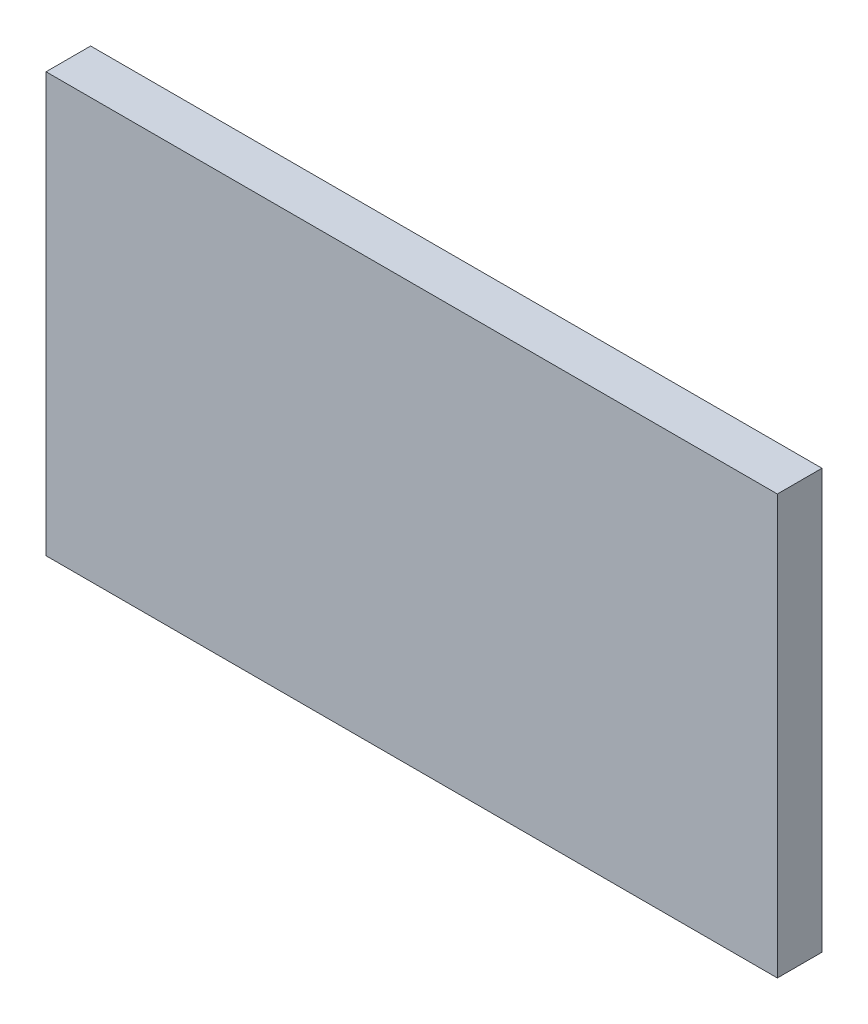
ISO-10303-21;
HEADER;
FILE_DESCRIPTION(('STEP AP214'),'2;1');
FILE_NAME('part.step','',(''),(''),'','','');
FILE_SCHEMA(('AUTOMOTIVE_DESIGN { 1 0 10303 214 1 1 1 1 }'));
ENDSEC;
DATA;
#1=APPLICATION_CONTEXT('core data for automotive mechanical design processes');
#2=APPLICATION_PROTOCOL_DEFINITION('international standard','automotive_design',2000,#1);
#3=PRODUCT_CONTEXT('',#1,'mechanical');
#4=PRODUCT('Part','Part','',(#3));
#5=PRODUCT_RELATED_PRODUCT_CATEGORY('part','',(#4));
#6=PRODUCT_DEFINITION_FORMATION('','',#4);
#7=PRODUCT_DEFINITION_CONTEXT('part definition',#1,'design');
#8=PRODUCT_DEFINITION('design','',#6,#7);
#9=PRODUCT_DEFINITION_SHAPE('','',#8);
#10=(LENGTH_UNIT() NAMED_UNIT(*) SI_UNIT(.MILLI.,.METRE.));
#11=(NAMED_UNIT(*) PLANE_ANGLE_UNIT() SI_UNIT($,.RADIAN.));
#12=(NAMED_UNIT(*) SI_UNIT($,.STERADIAN.) SOLID_ANGLE_UNIT());
#13=UNCERTAINTY_MEASURE_WITH_UNIT(LENGTH_MEASURE(1.E-05),#10,'distance_accuracy_value','');
#14=(GEOMETRIC_REPRESENTATION_CONTEXT(3) GLOBAL_UNCERTAINTY_ASSIGNED_CONTEXT((#13)) GLOBAL_UNIT_ASSIGNED_CONTEXT((#10,
#11,#12)) REPRESENTATION_CONTEXT('',''));
#15=CARTESIAN_POINT('',(0.,0.,0.));
#16=DIRECTION('',(0.,0.,1.));
#17=DIRECTION('',(1.,0.,0.));
#18=AXIS2_PLACEMENT_3D('',#15,#16,#17);
#19=CARTESIAN_POINT('',(0.,0.,1.));
#20=DIRECTION('',(1.,0.,0.));
#21=DIRECTION('',(0.,0.,-1.));
#22=AXIS2_PLACEMENT_3D('',#19,#20,#21);
#23=PLANE('',#22);
#24=DIRECTION('',(0.,-1.,0.));
#25=VECTOR('',#24,1.);
#26=CARTESIAN_POINT('',(0.,0.,0.));
#27=LINE('',#26,#25);
#28=CARTESIAN_POINT('',(0.,9.4,0.));
#29=VERTEX_POINT('',#28);
#30=CARTESIAN_POINT('',(0.,0.,0.));
#31=VERTEX_POINT('',#30);
#32=EDGE_CURVE('E110',#29,#31,#27,.T.);
#33=ORIENTED_EDGE('',*,*,#32,.T.);
#34=DIRECTION('',(0.,0.,-1.));
#35=VECTOR('',#34,1.);
#36=CARTESIAN_POINT('',(0.,0.,1.));
#37=LINE('',#36,#35);
#38=CARTESIAN_POINT('',(0.,0.,1.));
#39=VERTEX_POINT('',#38);
#40=EDGE_CURVE('E11',#39,#31,#37,.T.);
#41=ORIENTED_EDGE('',*,*,#40,.F.);
#42=DIRECTION('',(0.,-1.,0.));
#43=VECTOR('',#42,1.);
#44=CARTESIAN_POINT('',(0.,0.,1.));
#45=LINE('',#44,#43);
#46=CARTESIAN_POINT('',(0.,9.4,1.));
#47=VERTEX_POINT('',#46);
#48=EDGE_CURVE('E94',#47,#39,#45,.T.);
#49=ORIENTED_EDGE('',*,*,#48,.F.);
#50=DIRECTION('',(0.,0.,-1.));
#51=VECTOR('',#50,1.);
#52=CARTESIAN_POINT('',(0.,9.4,1.));
#53=LINE('',#52,#51);
#54=EDGE_CURVE('E106',#47,#29,#53,.T.);
#55=ORIENTED_EDGE('',*,*,#54,.T.);
#56=EDGE_LOOP('',(#33,#41,#49,#55));
#57=FACE_BOUND('',#56,.T.);
#58=ADVANCED_FACE('F42',(#57),#23,.F.);
#59=CARTESIAN_POINT('',(0.,0.,1.));
#60=DIRECTION('',(0.,1.,0.));
#61=DIRECTION('',(0.,0.,1.));
#62=AXIS2_PLACEMENT_3D('',#59,#60,#61);
#63=PLANE('',#62);
#64=DIRECTION('',(1.,0.,0.));
#65=VECTOR('',#64,1.);
#66=CARTESIAN_POINT('',(0.,0.,0.));
#67=LINE('',#66,#65);
#68=CARTESIAN_POINT('',(16.4,0.,0.));
#69=VERTEX_POINT('',#68);
#70=EDGE_CURVE('E99',#31,#69,#67,.T.);
#71=ORIENTED_EDGE('',*,*,#70,.T.);
#72=DIRECTION('',(0.,0.,-1.));
#73=VECTOR('',#72,1.);
#74=CARTESIAN_POINT('',(16.4,0.,1.));
#75=LINE('',#74,#73);
#76=CARTESIAN_POINT('',(16.4,0.,1.));
#77=VERTEX_POINT('',#76);
#78=EDGE_CURVE('E51',#77,#69,#75,.T.);
#79=ORIENTED_EDGE('',*,*,#78,.F.);
#80=DIRECTION('',(1.,0.,0.));
#81=VECTOR('',#80,1.);
#82=CARTESIAN_POINT('',(0.,0.,1.));
#83=LINE('',#82,#81);
#84=EDGE_CURVE('E89',#39,#77,#83,.T.);
#85=ORIENTED_EDGE('',*,*,#84,.F.);
#86=ORIENTED_EDGE('',*,*,#40,.T.);
#87=EDGE_LOOP('',(#71,#79,#85,#86));
#88=FACE_BOUND('',#87,.T.);
#89=ADVANCED_FACE('F98',(#88),#63,.F.);
#90=CARTESIAN_POINT('',(16.4,0.,1.));
#91=DIRECTION('',(-1.,0.,0.));
#92=DIRECTION('',(0.,0.,1.));
#93=AXIS2_PLACEMENT_3D('',#90,#91,#92);
#94=PLANE('',#93);
#95=DIRECTION('',(0.,1.,0.));
#96=VECTOR('',#95,1.);
#97=CARTESIAN_POINT('',(16.4,0.,0.));
#98=LINE('',#97,#96);
#99=CARTESIAN_POINT('',(16.4,9.4,0.));
#100=VERTEX_POINT('',#99);
#101=EDGE_CURVE('E76',#69,#100,#98,.T.);
#102=ORIENTED_EDGE('',*,*,#101,.T.);
#103=DIRECTION('',(0.,0.,-1.));
#104=VECTOR('',#103,1.);
#105=CARTESIAN_POINT('',(16.4,9.4,1.));
#106=LINE('',#105,#104);
#107=CARTESIAN_POINT('',(16.4,9.4,1.));
#108=VERTEX_POINT('',#107);
#109=EDGE_CURVE('E101',#108,#100,#106,.T.);
#110=ORIENTED_EDGE('',*,*,#109,.F.);
#111=DIRECTION('',(0.,1.,0.));
#112=VECTOR('',#111,1.);
#113=CARTESIAN_POINT('',(16.4,0.,1.));
#114=LINE('',#113,#112);
#115=EDGE_CURVE('E92',#77,#108,#114,.T.);
#116=ORIENTED_EDGE('',*,*,#115,.F.);
#117=ORIENTED_EDGE('',*,*,#78,.T.);
#118=EDGE_LOOP('',(#102,#110,#116,#117));
#119=FACE_BOUND('',#118,.T.);
#120=ADVANCED_FACE('F102',(#119),#94,.F.);
#121=CARTESIAN_POINT('',(0.,9.4,1.));
#122=DIRECTION('',(0.,-1.,0.));
#123=DIRECTION('',(0.,0.,-1.));
#124=AXIS2_PLACEMENT_3D('',#121,#122,#123);
#125=PLANE('',#124);
#126=DIRECTION('',(-1.,0.,0.));
#127=VECTOR('',#126,1.);
#128=CARTESIAN_POINT('',(0.,9.4,0.));
#129=LINE('',#128,#127);
#130=EDGE_CURVE('E82',#100,#29,#129,.T.);
#131=ORIENTED_EDGE('',*,*,#130,.T.);
#132=ORIENTED_EDGE('',*,*,#54,.F.);
#133=DIRECTION('',(-1.,0.,0.));
#134=VECTOR('',#133,1.);
#135=CARTESIAN_POINT('',(0.,9.4,1.));
#136=LINE('',#135,#134);
#137=EDGE_CURVE('E59',#108,#47,#136,.T.);
#138=ORIENTED_EDGE('',*,*,#137,.F.);
#139=ORIENTED_EDGE('',*,*,#109,.T.);
#140=EDGE_LOOP('',(#131,#132,#138,#139));
#141=FACE_BOUND('',#140,.T.);
#142=ADVANCED_FACE('F123',(#141),#125,.F.);
#143=CARTESIAN_POINT('',(0.,0.,1.));
#144=DIRECTION('',(0.,0.,-1.));
#145=DIRECTION('',(-1.,0.,0.));
#146=AXIS2_PLACEMENT_3D('',#143,#144,#145);
#147=PLANE('',#146);
#148=ORIENTED_EDGE('',*,*,#48,.T.);
#149=ORIENTED_EDGE('',*,*,#84,.T.);
#150=ORIENTED_EDGE('',*,*,#115,.T.);
#151=ORIENTED_EDGE('',*,*,#137,.T.);
#152=EDGE_LOOP('',(#148,#149,#150,#151));
#153=FACE_BOUND('',#152,.T.);
#154=ADVANCED_FACE('F90',(#153),#147,.F.);
#155=CARTESIAN_POINT('',(0.,0.,0.));
#156=DIRECTION('',(0.,0.,-1.));
#157=DIRECTION('',(-1.,0.,0.));
#158=AXIS2_PLACEMENT_3D('',#155,#156,#157);
#159=PLANE('',#158);
#160=ORIENTED_EDGE('',*,*,#32,.F.);
#161=ORIENTED_EDGE('',*,*,#130,.F.);
#162=ORIENTED_EDGE('',*,*,#101,.F.);
#163=ORIENTED_EDGE('',*,*,#70,.F.);
#164=EDGE_LOOP('',(#160,#161,#162,#163));
#165=FACE_BOUND('',#164,.T.);
#166=ADVANCED_FACE('F126',(#165),#159,.T.);
#167=CLOSED_SHELL('',(#58,#89,#120,#142,#154,#166));
#168=MANIFOLD_SOLID_BREP('B2',#167);
#169=ADVANCED_BREP_SHAPE_REPRESENTATION('',(#18,#168),#14);
#170=SHAPE_DEFINITION_REPRESENTATION(#9,#169);
ENDSEC;
END-ISO-10303-21;
